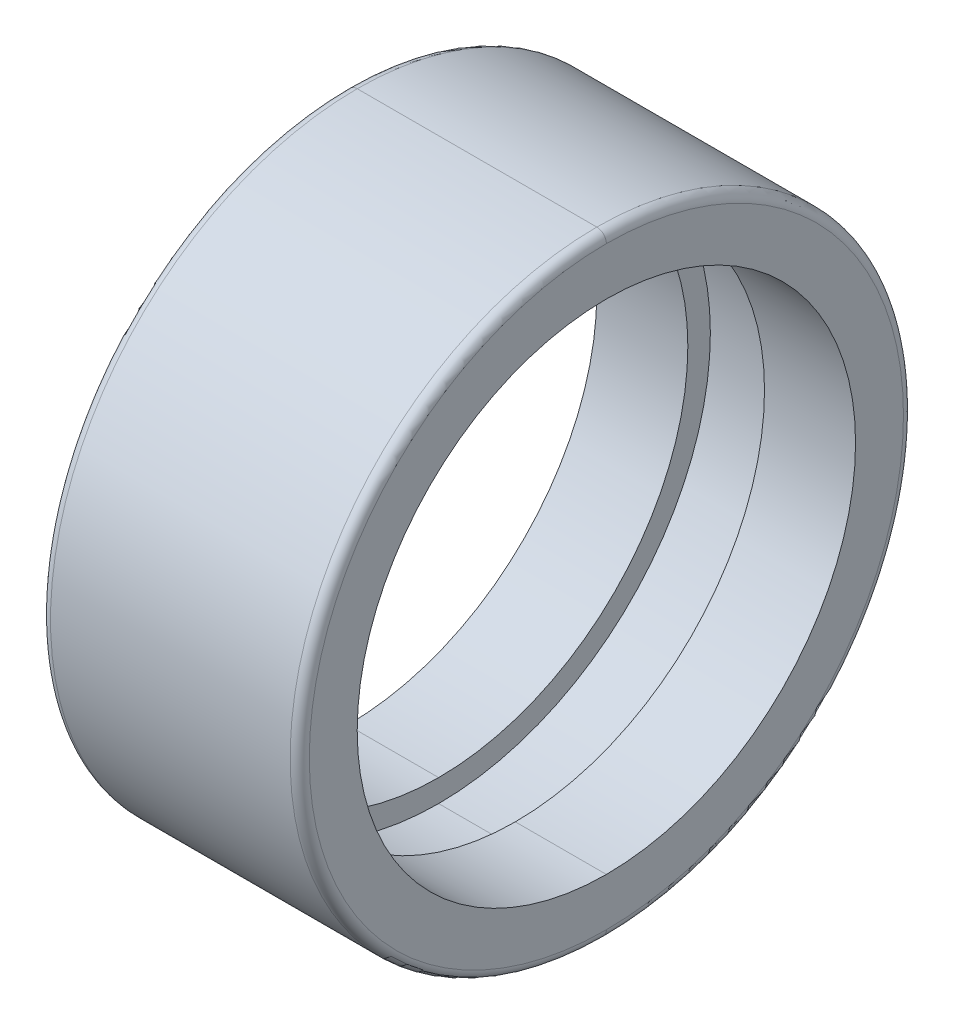
ISO-10303-21;
HEADER;
FILE_DESCRIPTION(('STEP AP214'),'2;1');
FILE_NAME('part.step','',(''),(''),'','','');
FILE_SCHEMA(('AUTOMOTIVE_DESIGN { 1 0 10303 214 1 1 1 1 }'));
ENDSEC;
DATA;
#1=APPLICATION_CONTEXT('core data for automotive mechanical design processes');
#2=APPLICATION_PROTOCOL_DEFINITION('international standard','automotive_design',2000,#1);
#3=PRODUCT_CONTEXT('',#1,'mechanical');
#4=PRODUCT('Part','Part','',(#3));
#5=PRODUCT_RELATED_PRODUCT_CATEGORY('part','',(#4));
#6=PRODUCT_DEFINITION_FORMATION('','',#4);
#7=PRODUCT_DEFINITION_CONTEXT('part definition',#1,'design');
#8=PRODUCT_DEFINITION('design','',#6,#7);
#9=PRODUCT_DEFINITION_SHAPE('','',#8);
#10=(LENGTH_UNIT() NAMED_UNIT(*) SI_UNIT(.MILLI.,.METRE.));
#11=(NAMED_UNIT(*) PLANE_ANGLE_UNIT() SI_UNIT($,.RADIAN.));
#12=(NAMED_UNIT(*) SI_UNIT($,.STERADIAN.) SOLID_ANGLE_UNIT());
#13=UNCERTAINTY_MEASURE_WITH_UNIT(LENGTH_MEASURE(1.E-05),#10,'distance_accuracy_value','');
#14=(GEOMETRIC_REPRESENTATION_CONTEXT(3) GLOBAL_UNCERTAINTY_ASSIGNED_CONTEXT((#13)) GLOBAL_UNIT_ASSIGNED_CONTEXT((#10,
#11,#12)) REPRESENTATION_CONTEXT('',''));
#15=CARTESIAN_POINT('',(0.,0.,0.));
#16=DIRECTION('',(0.,0.,1.));
#17=DIRECTION('',(1.,0.,0.));
#18=AXIS2_PLACEMENT_3D('',#15,#16,#17);
#19=CARTESIAN_POINT('',(0.,0.,0.));
#20=DIRECTION('',(1.,0.,0.));
#21=DIRECTION('',(0.,-1.,0.));
#22=AXIS2_PLACEMENT_3D('',#19,#20,#21);
#23=PLANE('',#22);
#24=CARTESIAN_POINT('',(0.,0.,0.));
#25=DIRECTION('',(-1.,0.,0.));
#26=DIRECTION('',(0.,1.,0.));
#27=AXIS2_PLACEMENT_3D('',#24,#25,#26);
#28=CIRCLE('',#27,31.);
#29=CARTESIAN_POINT('',(0.,31.,6.49323187810562E-13));
#30=VERTEX_POINT('',#29);
#31=CARTESIAN_POINT('',(0.,-31.,-6.48027927615166E-13));
#32=VERTEX_POINT('',#31);
#33=EDGE_CURVE('E11',#30,#32,#28,.T.);
#34=ORIENTED_EDGE('',*,*,#33,.T.);
#35=CARTESIAN_POINT('',(0.,0.,0.));
#36=DIRECTION('',(-1.,0.,0.));
#37=DIRECTION('',(0.,-1.,0.));
#38=AXIS2_PLACEMENT_3D('',#35,#36,#37);
#39=CIRCLE('',#38,31.);
#40=EDGE_CURVE('E27',#32,#30,#39,.T.);
#41=ORIENTED_EDGE('',*,*,#40,.T.);
#42=EDGE_LOOP('',(#34,#41));
#43=FACE_BOUND('',#42,.T.);
#44=CARTESIAN_POINT('',(0.,0.,0.));
#45=DIRECTION('',(-1.,0.,0.));
#46=DIRECTION('',(0.,1.,0.));
#47=AXIS2_PLACEMENT_3D('',#44,#45,#46);
#48=CIRCLE('',#47,26.);
#49=CARTESIAN_POINT('',(0.,26.,0.));
#50=VERTEX_POINT('',#49);
#51=CARTESIAN_POINT('',(0.,-26.,0.));
#52=VERTEX_POINT('',#51);
#53=EDGE_CURVE('E163',#50,#52,#48,.T.);
#54=ORIENTED_EDGE('',*,*,#53,.F.);
#55=CARTESIAN_POINT('',(0.,0.,0.));
#56=DIRECTION('',(-1.,0.,0.));
#57=DIRECTION('',(0.,-1.,0.));
#58=AXIS2_PLACEMENT_3D('',#55,#56,#57);
#59=CIRCLE('',#58,26.);
#60=EDGE_CURVE('E138',#52,#50,#59,.T.);
#61=ORIENTED_EDGE('',*,*,#60,.F.);
#62=EDGE_LOOP('',(#54,#61));
#63=FACE_BOUND('',#62,.T.);
#64=ADVANCED_FACE('F16',(#43,#63),#23,.F.);
#65=CARTESIAN_POINT('',(1.,0.,0.));
#66=DIRECTION('',(1.,0.,0.));
#67=DIRECTION('',(0.,0.999977138039479,0.00676190789437144));
#68=AXIS2_PLACEMENT_3D('',#65,#66,#67);
#69=TOROIDAL_SURFACE('',#68,31.,1.);
#70=CARTESIAN_POINT('',(1.,31.,1.94796956343168E-12));
#71=DIRECTION('',(0.,0.,-1.));
#72=DIRECTION('',(-1.,0.,0.));
#73=AXIS2_PLACEMENT_3D('',#70,#71,#72);
#74=CIRCLE('',#73,1.);
#75=CARTESIAN_POINT('',(1.,32.,4.99762670503126E-13));
#76=VERTEX_POINT('',#75);
#77=EDGE_CURVE('E157',#30,#76,#74,.T.);
#78=ORIENTED_EDGE('',*,*,#77,.T.);
#79=CARTESIAN_POINT('',(1.,0.,0.));
#80=DIRECTION('',(-1.,0.,0.));
#81=DIRECTION('',(0.,1.,0.));
#82=AXIS2_PLACEMENT_3D('',#79,#80,#81);
#83=CIRCLE('',#82,32.);
#84=CARTESIAN_POINT('',(1.,-32.,-4.99739605855686E-13));
#85=VERTEX_POINT('',#84);
#86=EDGE_CURVE('E154',#76,#85,#83,.T.);
#87=ORIENTED_EDGE('',*,*,#86,.T.);
#88=CARTESIAN_POINT('',(1.,-31.,-1.9440837828455E-12));
#89=DIRECTION('',(0.,0.,1.));
#90=DIRECTION('',(-1.,0.,0.));
#91=AXIS2_PLACEMENT_3D('',#88,#89,#90);
#92=CIRCLE('',#91,1.);
#93=EDGE_CURVE('E158',#32,#85,#92,.T.);
#94=ORIENTED_EDGE('',*,*,#93,.F.);
#95=ORIENTED_EDGE('',*,*,#33,.F.);
#96=EDGE_LOOP('',(#78,#87,#94,#95));
#97=FACE_BOUND('',#96,.T.);
#98=ADVANCED_FACE('F227',(#97),#69,.T.);
#99=CARTESIAN_POINT('',(1.,0.,0.));
#100=DIRECTION('',(1.,0.,0.));
#101=DIRECTION('',(0.,-0.999977138039479,-0.00676190789437132));
#102=AXIS2_PLACEMENT_3D('',#99,#100,#101);
#103=TOROIDAL_SURFACE('',#102,31.,1.);
#104=ORIENTED_EDGE('',*,*,#93,.T.);
#105=CARTESIAN_POINT('',(1.,0.,0.));
#106=DIRECTION('',(-1.,0.,0.));
#107=DIRECTION('',(0.,-1.,0.));
#108=AXIS2_PLACEMENT_3D('',#105,#106,#107);
#109=CIRCLE('',#108,32.);
#110=EDGE_CURVE('E193',#85,#76,#109,.T.);
#111=ORIENTED_EDGE('',*,*,#110,.T.);
#112=ORIENTED_EDGE('',*,*,#77,.F.);
#113=ORIENTED_EDGE('',*,*,#40,.F.);
#114=EDGE_LOOP('',(#104,#111,#112,#113));
#115=FACE_BOUND('',#114,.T.);
#116=ADVANCED_FACE('F221',(#115),#103,.T.);
#117=CARTESIAN_POINT('',(0.,0.,0.));
#118=DIRECTION('',(-1.,0.,0.));
#119=DIRECTION('',(0.,-1.,0.));
#120=AXIS2_PLACEMENT_3D('',#117,#118,#119);
#121=CYLINDRICAL_SURFACE('',#120,26.);
#122=DIRECTION('',(1.,0.,0.));
#123=VECTOR('',#122,1.);
#124=CARTESIAN_POINT('',(0.,26.,0.));
#125=LINE('',#124,#123);
#126=CARTESIAN_POINT('',(9.5,26.,0.));
#127=VERTEX_POINT('',#126);
#128=EDGE_CURVE('E142',#50,#127,#125,.T.);
#129=ORIENTED_EDGE('',*,*,#128,.F.);
#130=ORIENTED_EDGE('',*,*,#53,.T.);
#131=DIRECTION('',(1.,0.,0.));
#132=VECTOR('',#131,1.);
#133=CARTESIAN_POINT('',(0.,-26.,0.));
#134=LINE('',#133,#132);
#135=CARTESIAN_POINT('',(9.5,-26.,0.));
#136=VERTEX_POINT('',#135);
#137=EDGE_CURVE('E149',#52,#136,#134,.T.);
#138=ORIENTED_EDGE('',*,*,#137,.T.);
#139=CARTESIAN_POINT('',(9.5,0.,0.));
#140=DIRECTION('',(1.,0.,0.));
#141=DIRECTION('',(0.,-1.,0.));
#142=AXIS2_PLACEMENT_3D('',#139,#140,#141);
#143=CIRCLE('',#142,26.);
#144=EDGE_CURVE('E141',#136,#127,#143,.T.);
#145=ORIENTED_EDGE('',*,*,#144,.T.);
#146=EDGE_LOOP('',(#129,#130,#138,#145));
#147=FACE_BOUND('',#146,.T.);
#148=ADVANCED_FACE('F272',(#147),#121,.F.);
#149=CARTESIAN_POINT('',(0.,0.,0.));
#150=DIRECTION('',(-1.,0.,0.));
#151=DIRECTION('',(0.,-1.,0.));
#152=AXIS2_PLACEMENT_3D('',#149,#150,#151);
#153=CYLINDRICAL_SURFACE('',#152,26.);
#154=ORIENTED_EDGE('',*,*,#137,.F.);
#155=ORIENTED_EDGE('',*,*,#60,.T.);
#156=ORIENTED_EDGE('',*,*,#128,.T.);
#157=CARTESIAN_POINT('',(9.5,0.,0.));
#158=DIRECTION('',(1.,0.,0.));
#159=DIRECTION('',(0.,1.,0.));
#160=AXIS2_PLACEMENT_3D('',#157,#158,#159);
#161=CIRCLE('',#160,26.);
#162=EDGE_CURVE('E145',#127,#136,#161,.T.);
#163=ORIENTED_EDGE('',*,*,#162,.T.);
#164=EDGE_LOOP('',(#154,#155,#156,#163));
#165=FACE_BOUND('',#164,.T.);
#166=ADVANCED_FACE('F18',(#165),#153,.F.);
#167=CARTESIAN_POINT('',(0.,0.,0.));
#168=DIRECTION('',(-1.,0.,0.));
#169=DIRECTION('',(0.,-1.,0.));
#170=AXIS2_PLACEMENT_3D('',#167,#168,#169);
#171=CYLINDRICAL_SURFACE('',#170,32.);
#172=DIRECTION('',(1.,0.,0.));
#173=VECTOR('',#172,1.);
#174=CARTESIAN_POINT('',(1.,-32.,0.));
#175=LINE('',#174,#173);
#176=CARTESIAN_POINT('',(26.,-32.,2.83254135672695E-13));
#177=VERTEX_POINT('',#176);
#178=EDGE_CURVE('E132',#85,#177,#175,.T.);
#179=ORIENTED_EDGE('',*,*,#178,.F.);
#180=ORIENTED_EDGE('',*,*,#86,.F.);
#181=DIRECTION('',(1.,0.,0.));
#182=VECTOR('',#181,1.);
#183=CARTESIAN_POINT('',(1.,32.,0.));
#184=LINE('',#183,#182);
#185=CARTESIAN_POINT('',(26.,32.,-2.82106522542247E-13));
#186=VERTEX_POINT('',#185);
#187=EDGE_CURVE('E184',#76,#186,#184,.T.);
#188=ORIENTED_EDGE('',*,*,#187,.T.);
#189=CARTESIAN_POINT('',(26.,0.,0.));
#190=DIRECTION('',(1.,0.,0.));
#191=DIRECTION('',(0.,-1.,0.));
#192=AXIS2_PLACEMENT_3D('',#189,#190,#191);
#193=CIRCLE('',#192,32.);
#194=EDGE_CURVE('E175',#177,#186,#193,.T.);
#195=ORIENTED_EDGE('',*,*,#194,.F.);
#196=EDGE_LOOP('',(#179,#180,#188,#195));
#197=FACE_BOUND('',#196,.T.);
#198=ADVANCED_FACE('F231',(#197),#171,.T.);
#199=CARTESIAN_POINT('',(0.,0.,0.));
#200=DIRECTION('',(-1.,0.,0.));
#201=DIRECTION('',(0.,-1.,0.));
#202=AXIS2_PLACEMENT_3D('',#199,#200,#201);
#203=CYLINDRICAL_SURFACE('',#202,32.);
#204=ORIENTED_EDGE('',*,*,#187,.F.);
#205=ORIENTED_EDGE('',*,*,#110,.F.);
#206=ORIENTED_EDGE('',*,*,#178,.T.);
#207=CARTESIAN_POINT('',(26.,0.,0.));
#208=DIRECTION('',(1.,0.,0.));
#209=DIRECTION('',(0.,1.,0.));
#210=AXIS2_PLACEMENT_3D('',#207,#208,#209);
#211=CIRCLE('',#210,32.);
#212=EDGE_CURVE('E133',#186,#177,#211,.T.);
#213=ORIENTED_EDGE('',*,*,#212,.F.);
#214=EDGE_LOOP('',(#204,#205,#206,#213));
#215=FACE_BOUND('',#214,.T.);
#216=ADVANCED_FACE('F233',(#215),#203,.T.);
#217=CARTESIAN_POINT('',(9.5,0.,0.));
#218=DIRECTION('',(1.,0.,0.));
#219=DIRECTION('',(0.,-1.,0.));
#220=AXIS2_PLACEMENT_3D('',#217,#218,#219);
#221=PLANE('',#220);
#222=ORIENTED_EDGE('',*,*,#144,.F.);
#223=ORIENTED_EDGE('',*,*,#162,.F.);
#224=EDGE_LOOP('',(#222,#223));
#225=FACE_BOUND('',#224,.T.);
#226=CARTESIAN_POINT('',(9.5,0.,0.));
#227=DIRECTION('',(1.,0.,0.));
#228=DIRECTION('',(0.,1.,0.));
#229=AXIS2_PLACEMENT_3D('',#226,#227,#228);
#230=CIRCLE('',#229,28.35);
#231=CARTESIAN_POINT('',(9.5,28.35,0.));
#232=VERTEX_POINT('',#231);
#233=CARTESIAN_POINT('',(9.5,-28.35,0.));
#234=VERTEX_POINT('',#233);
#235=EDGE_CURVE('E130',#232,#234,#230,.T.);
#236=ORIENTED_EDGE('',*,*,#235,.T.);
#237=CARTESIAN_POINT('',(9.5,0.,0.));
#238=DIRECTION('',(1.,0.,0.));
#239=DIRECTION('',(0.,-1.,0.));
#240=AXIS2_PLACEMENT_3D('',#237,#238,#239);
#241=CIRCLE('',#240,28.35);
#242=EDGE_CURVE('E105',#234,#232,#241,.T.);
#243=ORIENTED_EDGE('',*,*,#242,.T.);
#244=EDGE_LOOP('',(#236,#243));
#245=FACE_BOUND('',#244,.T.);
#246=ADVANCED_FACE('F274',(#225,#245),#221,.T.);
#247=CARTESIAN_POINT('',(26.,0.,0.));
#248=DIRECTION('',(1.,0.,0.));
#249=DIRECTION('',(0.,-0.999988670837495,0.00476006267407735));
#250=AXIS2_PLACEMENT_3D('',#247,#248,#249);
#251=TOROIDAL_SURFACE('',#250,31.,1.);
#252=CARTESIAN_POINT('',(26.,-31.,1.09001696557698E-12));
#253=DIRECTION('',(0.,0.,-1.));
#254=DIRECTION('',(1.,0.,0.));
#255=AXIS2_PLACEMENT_3D('',#252,#253,#254);
#256=CIRCLE('',#255,1.);
#257=CARTESIAN_POINT('',(27.,-31.,3.63338988525659E-13));
#258=VERTEX_POINT('',#257);
#259=EDGE_CURVE('E169',#258,#177,#256,.T.);
#260=ORIENTED_EDGE('',*,*,#259,.T.);
#261=ORIENTED_EDGE('',*,*,#194,.T.);
#262=CARTESIAN_POINT('',(26.,31.,-1.08177355961914E-12));
#263=DIRECTION('',(0.,0.,1.));
#264=DIRECTION('',(1.,0.,0.));
#265=AXIS2_PLACEMENT_3D('',#262,#263,#264);
#266=CIRCLE('',#265,1.);
#267=CARTESIAN_POINT('',(27.,31.,-3.60591186539713E-13));
#268=VERTEX_POINT('',#267);
#269=EDGE_CURVE('E137',#268,#186,#266,.T.);
#270=ORIENTED_EDGE('',*,*,#269,.F.);
#271=CARTESIAN_POINT('',(27.,0.,0.));
#272=DIRECTION('',(1.,0.,0.));
#273=DIRECTION('',(0.,-1.,0.));
#274=AXIS2_PLACEMENT_3D('',#271,#272,#273);
#275=CIRCLE('',#274,31.);
#276=EDGE_CURVE('E120',#258,#268,#275,.T.);
#277=ORIENTED_EDGE('',*,*,#276,.F.);
#278=EDGE_LOOP('',(#260,#261,#270,#277));
#279=FACE_BOUND('',#278,.T.);
#280=ADVANCED_FACE('F238',(#279),#251,.T.);
#281=CARTESIAN_POINT('',(26.,0.,0.));
#282=DIRECTION('',(1.,0.,0.));
#283=DIRECTION('',(0.,0.999988670837495,-0.00476006267407758));
#284=AXIS2_PLACEMENT_3D('',#281,#282,#283);
#285=TOROIDAL_SURFACE('',#284,31.,1.);
#286=ORIENTED_EDGE('',*,*,#269,.T.);
#287=ORIENTED_EDGE('',*,*,#212,.T.);
#288=ORIENTED_EDGE('',*,*,#259,.F.);
#289=CARTESIAN_POINT('',(27.,0.,0.));
#290=DIRECTION('',(1.,0.,0.));
#291=DIRECTION('',(0.,1.,0.));
#292=AXIS2_PLACEMENT_3D('',#289,#290,#291);
#293=CIRCLE('',#292,31.);
#294=EDGE_CURVE('E126',#268,#258,#293,.T.);
#295=ORIENTED_EDGE('',*,*,#294,.F.);
#296=EDGE_LOOP('',(#286,#287,#288,#295));
#297=FACE_BOUND('',#296,.T.);
#298=ADVANCED_FACE('F235',(#297),#285,.T.);
#299=CARTESIAN_POINT('',(9.5,0.,0.));
#300=DIRECTION('',(-1.,0.,0.));
#301=DIRECTION('',(0.,-1.,0.));
#302=AXIS2_PLACEMENT_3D('',#299,#300,#301);
#303=CYLINDRICAL_SURFACE('',#302,28.35);
#304=DIRECTION('',(1.,0.,0.));
#305=VECTOR('',#304,1.);
#306=CARTESIAN_POINT('',(9.5,28.35,0.));
#307=LINE('',#306,#305);
#308=CARTESIAN_POINT('',(17.5,28.35,0.));
#309=VERTEX_POINT('',#308);
#310=EDGE_CURVE('E114',#232,#309,#307,.T.);
#311=ORIENTED_EDGE('',*,*,#310,.T.);
#312=CARTESIAN_POINT('',(17.5,0.,0.));
#313=DIRECTION('',(1.,0.,0.));
#314=DIRECTION('',(0.,1.,0.));
#315=AXIS2_PLACEMENT_3D('',#312,#313,#314);
#316=CIRCLE('',#315,28.35);
#317=CARTESIAN_POINT('',(17.5,-28.35,0.));
#318=VERTEX_POINT('',#317);
#319=EDGE_CURVE('E110',#309,#318,#316,.T.);
#320=ORIENTED_EDGE('',*,*,#319,.T.);
#321=DIRECTION('',(1.,0.,0.));
#322=VECTOR('',#321,1.);
#323=CARTESIAN_POINT('',(9.5,-28.35,0.));
#324=LINE('',#323,#322);
#325=EDGE_CURVE('E99',#234,#318,#324,.T.);
#326=ORIENTED_EDGE('',*,*,#325,.F.);
#327=ORIENTED_EDGE('',*,*,#235,.F.);
#328=EDGE_LOOP('',(#311,#320,#326,#327));
#329=FACE_BOUND('',#328,.T.);
#330=ADVANCED_FACE('F113',(#329),#303,.F.);
#331=CARTESIAN_POINT('',(9.5,0.,0.));
#332=DIRECTION('',(-1.,0.,0.));
#333=DIRECTION('',(0.,-1.,0.));
#334=AXIS2_PLACEMENT_3D('',#331,#332,#333);
#335=CYLINDRICAL_SURFACE('',#334,28.35);
#336=ORIENTED_EDGE('',*,*,#325,.T.);
#337=CARTESIAN_POINT('',(17.5,0.,0.));
#338=DIRECTION('',(1.,0.,0.));
#339=DIRECTION('',(0.,-1.,0.));
#340=AXIS2_PLACEMENT_3D('',#337,#338,#339);
#341=CIRCLE('',#340,28.35);
#342=EDGE_CURVE('E104',#318,#309,#341,.T.);
#343=ORIENTED_EDGE('',*,*,#342,.T.);
#344=ORIENTED_EDGE('',*,*,#310,.F.);
#345=ORIENTED_EDGE('',*,*,#242,.F.);
#346=EDGE_LOOP('',(#336,#343,#344,#345));
#347=FACE_BOUND('',#346,.T.);
#348=ADVANCED_FACE('F101',(#347),#335,.F.);
#349=CARTESIAN_POINT('',(27.,0.,0.));
#350=DIRECTION('',(1.,0.,0.));
#351=DIRECTION('',(0.,-1.,0.));
#352=AXIS2_PLACEMENT_3D('',#349,#350,#351);
#353=PLANE('',#352);
#354=ORIENTED_EDGE('',*,*,#276,.T.);
#355=ORIENTED_EDGE('',*,*,#294,.T.);
#356=EDGE_LOOP('',(#354,#355));
#357=FACE_BOUND('',#356,.T.);
#358=CARTESIAN_POINT('',(27.,0.,0.));
#359=DIRECTION('',(-1.,0.,0.));
#360=DIRECTION('',(0.,1.,0.));
#361=AXIS2_PLACEMENT_3D('',#358,#359,#360);
#362=CIRCLE('',#361,26.);
#363=CARTESIAN_POINT('',(27.,26.,0.));
#364=VERTEX_POINT('',#363);
#365=CARTESIAN_POINT('',(27.,-26.,0.));
#366=VERTEX_POINT('',#365);
#367=EDGE_CURVE('E153',#364,#366,#362,.T.);
#368=ORIENTED_EDGE('',*,*,#367,.T.);
#369=CARTESIAN_POINT('',(27.,0.,0.));
#370=DIRECTION('',(-1.,0.,0.));
#371=DIRECTION('',(0.,-1.,0.));
#372=AXIS2_PLACEMENT_3D('',#369,#370,#371);
#373=CIRCLE('',#372,26.);
#374=EDGE_CURVE('E87',#366,#364,#373,.T.);
#375=ORIENTED_EDGE('',*,*,#374,.T.);
#376=EDGE_LOOP('',(#368,#375));
#377=FACE_BOUND('',#376,.T.);
#378=ADVANCED_FACE('F240',(#357,#377),#353,.T.);
#379=CARTESIAN_POINT('',(17.5,0.,0.));
#380=DIRECTION('',(1.,0.,0.));
#381=DIRECTION('',(0.,-1.,0.));
#382=AXIS2_PLACEMENT_3D('',#379,#380,#381);
#383=PLANE('',#382);
#384=CARTESIAN_POINT('',(17.5,0.,0.));
#385=DIRECTION('',(1.,0.,0.));
#386=DIRECTION('',(0.,-1.,0.));
#387=AXIS2_PLACEMENT_3D('',#384,#385,#386);
#388=CIRCLE('',#387,26.);
#389=CARTESIAN_POINT('',(17.5,-26.,0.));
#390=VERTEX_POINT('',#389);
#391=CARTESIAN_POINT('',(17.5,26.,0.));
#392=VERTEX_POINT('',#391);
#393=EDGE_CURVE('E204',#390,#392,#388,.T.);
#394=ORIENTED_EDGE('',*,*,#393,.T.);
#395=CARTESIAN_POINT('',(17.5,0.,0.));
#396=DIRECTION('',(1.,0.,0.));
#397=DIRECTION('',(0.,1.,0.));
#398=AXIS2_PLACEMENT_3D('',#395,#396,#397);
#399=CIRCLE('',#398,26.);
#400=EDGE_CURVE('E20',#392,#390,#399,.T.);
#401=ORIENTED_EDGE('',*,*,#400,.T.);
#402=EDGE_LOOP('',(#394,#401));
#403=FACE_BOUND('',#402,.T.);
#404=ORIENTED_EDGE('',*,*,#319,.F.);
#405=ORIENTED_EDGE('',*,*,#342,.F.);
#406=EDGE_LOOP('',(#404,#405));
#407=FACE_BOUND('',#406,.T.);
#408=ADVANCED_FACE('F118',(#403,#407),#383,.F.);
#409=CARTESIAN_POINT('',(0.,0.,0.));
#410=DIRECTION('',(-1.,0.,0.));
#411=DIRECTION('',(0.,-1.,0.));
#412=AXIS2_PLACEMENT_3D('',#409,#410,#411);
#413=CYLINDRICAL_SURFACE('',#412,26.);
#414=DIRECTION('',(1.,0.,0.));
#415=VECTOR('',#414,1.);
#416=CARTESIAN_POINT('',(17.5,-26.,0.));
#417=LINE('',#416,#415);
#418=EDGE_CURVE('E164',#390,#366,#417,.T.);
#419=ORIENTED_EDGE('',*,*,#418,.T.);
#420=ORIENTED_EDGE('',*,*,#367,.F.);
#421=DIRECTION('',(1.,0.,0.));
#422=VECTOR('',#421,1.);
#423=CARTESIAN_POINT('',(17.5,26.,0.));
#424=LINE('',#423,#422);
#425=EDGE_CURVE('E167',#392,#364,#424,.T.);
#426=ORIENTED_EDGE('',*,*,#425,.F.);
#427=ORIENTED_EDGE('',*,*,#393,.F.);
#428=EDGE_LOOP('',(#419,#420,#426,#427));
#429=FACE_BOUND('',#428,.T.);
#430=ADVANCED_FACE('F245',(#429),#413,.F.);
#431=CARTESIAN_POINT('',(0.,0.,0.));
#432=DIRECTION('',(-1.,0.,0.));
#433=DIRECTION('',(0.,-1.,0.));
#434=AXIS2_PLACEMENT_3D('',#431,#432,#433);
#435=CYLINDRICAL_SURFACE('',#434,26.);
#436=ORIENTED_EDGE('',*,*,#425,.T.);
#437=ORIENTED_EDGE('',*,*,#374,.F.);
#438=ORIENTED_EDGE('',*,*,#418,.F.);
#439=ORIENTED_EDGE('',*,*,#400,.F.);
#440=EDGE_LOOP('',(#436,#437,#438,#439));
#441=FACE_BOUND('',#440,.T.);
#442=ADVANCED_FACE('F246',(#441),#435,.F.);
#443=CLOSED_SHELL('',(#64,#98,#116,#148,#166,#198,#216,#246,#280,#298,#330,#348,#378,#408,#430,#442));
#444=MANIFOLD_SOLID_BREP('B1',#443);
#445=ADVANCED_BREP_SHAPE_REPRESENTATION('',(#18,#444),#14);
#446=SHAPE_DEFINITION_REPRESENTATION(#9,#445);
ENDSEC;
END-ISO-10303-21;
